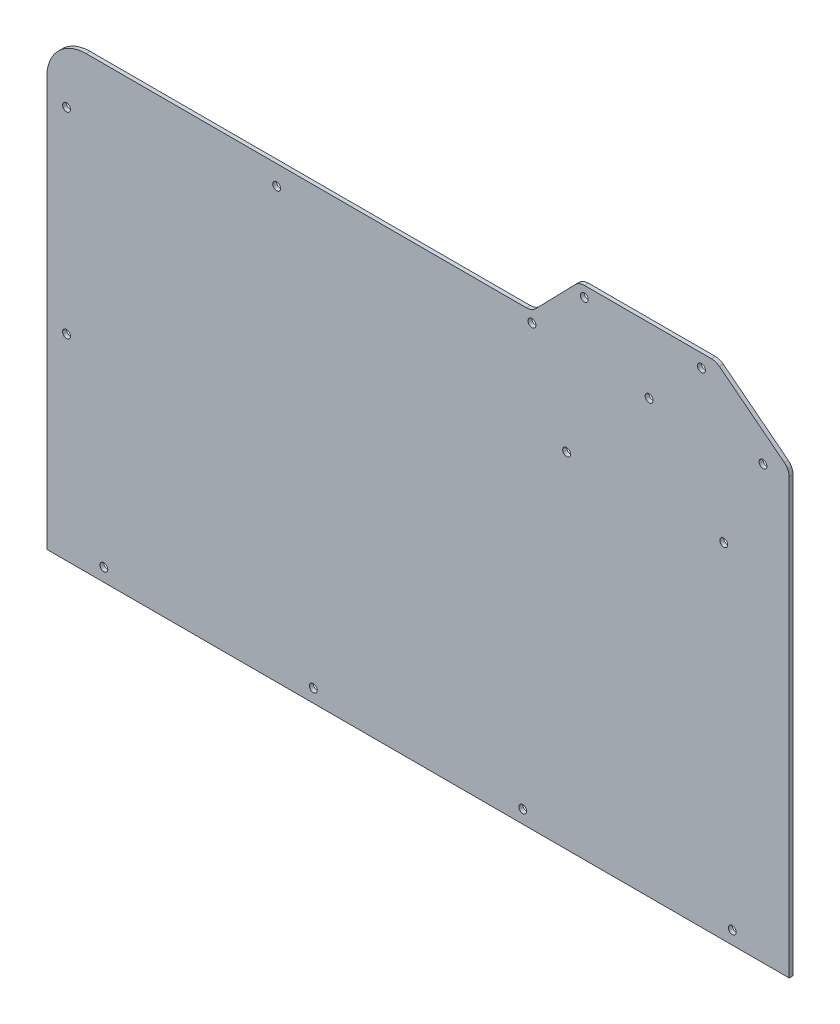
ISO-10303-21;
HEADER;
FILE_DESCRIPTION(('STEP AP214'),'2;1');
FILE_NAME('part.step','',(''),(''),'','','');
FILE_SCHEMA(('AUTOMOTIVE_DESIGN { 1 0 10303 214 1 1 1 1 }'));
ENDSEC;
DATA;
#1=APPLICATION_CONTEXT('core data for automotive mechanical design processes');
#2=APPLICATION_PROTOCOL_DEFINITION('international standard','automotive_design',2000,#1);
#3=PRODUCT_CONTEXT('',#1,'mechanical');
#4=PRODUCT('Part','Part','',(#3));
#5=PRODUCT_RELATED_PRODUCT_CATEGORY('part','',(#4));
#6=PRODUCT_DEFINITION_FORMATION('','',#4);
#7=PRODUCT_DEFINITION_CONTEXT('part definition',#1,'design');
#8=PRODUCT_DEFINITION('design','',#6,#7);
#9=PRODUCT_DEFINITION_SHAPE('','',#8);
#10=(LENGTH_UNIT() NAMED_UNIT(*) SI_UNIT(.MILLI.,.METRE.));
#11=(NAMED_UNIT(*) PLANE_ANGLE_UNIT() SI_UNIT($,.RADIAN.));
#12=(NAMED_UNIT(*) SI_UNIT($,.STERADIAN.) SOLID_ANGLE_UNIT());
#13=UNCERTAINTY_MEASURE_WITH_UNIT(LENGTH_MEASURE(1.E-05),#10,'distance_accuracy_value','');
#14=(GEOMETRIC_REPRESENTATION_CONTEXT(3) GLOBAL_UNCERTAINTY_ASSIGNED_CONTEXT((#13)) GLOBAL_UNIT_ASSIGNED_CONTEXT((#10,
#11,#12)) REPRESENTATION_CONTEXT('',''));
#15=CARTESIAN_POINT('',(0.,0.,0.));
#16=DIRECTION('',(0.,0.,1.));
#17=DIRECTION('',(1.,0.,0.));
#18=AXIS2_PLACEMENT_3D('',#15,#16,#17);
#19=CARTESIAN_POINT('',(0.,0.,1.5));
#20=DIRECTION('',(1.,0.,0.));
#21=DIRECTION('',(0.,0.,-1.));
#22=AXIS2_PLACEMENT_3D('',#19,#20,#21);
#23=PLANE('',#22);
#24=DIRECTION('',(0.,-1.,0.));
#25=VECTOR('',#24,1.);
#26=CARTESIAN_POINT('',(0.,0.,1.5));
#27=LINE('',#26,#25);
#28=CARTESIAN_POINT('',(0.,156.5,1.5));
#29=VERTEX_POINT('',#28);
#30=CARTESIAN_POINT('',(0.,0.,1.5));
#31=VERTEX_POINT('',#30);
#32=EDGE_CURVE('E121',#29,#31,#27,.T.);
#33=ORIENTED_EDGE('',*,*,#32,.F.);
#34=DIRECTION('',(0.,0.,-1.));
#35=VECTOR('',#34,1.);
#36=CARTESIAN_POINT('',(0.,156.5,1.5));
#37=LINE('',#36,#35);
#38=CARTESIAN_POINT('',(0.,156.5,0.));
#39=VERTEX_POINT('',#38);
#40=EDGE_CURVE('E186',#29,#39,#37,.T.);
#41=ORIENTED_EDGE('',*,*,#40,.T.);
#42=DIRECTION('',(0.,-1.,0.));
#43=VECTOR('',#42,1.);
#44=CARTESIAN_POINT('',(0.,0.,0.));
#45=LINE('',#44,#43);
#46=CARTESIAN_POINT('',(0.,0.,0.));
#47=VERTEX_POINT('',#46);
#48=EDGE_CURVE('E143',#39,#47,#45,.T.);
#49=ORIENTED_EDGE('',*,*,#48,.T.);
#50=DIRECTION('',(0.,0.,-1.));
#51=VECTOR('',#50,1.);
#52=CARTESIAN_POINT('',(0.,0.,1.5));
#53=LINE('',#52,#51);
#54=EDGE_CURVE('E137',#31,#47,#53,.T.);
#55=ORIENTED_EDGE('',*,*,#54,.F.);
#56=EDGE_LOOP('',(#33,#41,#49,#55));
#57=FACE_BOUND('',#56,.T.);
#58=ADVANCED_FACE('F33',(#57),#23,.F.);
#59=CARTESIAN_POINT('',(0.,0.,1.5));
#60=DIRECTION('',(0.,1.,0.));
#61=DIRECTION('',(0.,0.,1.));
#62=AXIS2_PLACEMENT_3D('',#59,#60,#61);
#63=PLANE('',#62);
#64=DIRECTION('',(1.,0.,0.));
#65=VECTOR('',#64,1.);
#66=CARTESIAN_POINT('',(0.,0.,0.));
#67=LINE('',#66,#65);
#68=CARTESIAN_POINT('',(283.5,0.,0.));
#69=VERTEX_POINT('',#68);
#70=EDGE_CURVE('E191',#47,#69,#67,.T.);
#71=ORIENTED_EDGE('',*,*,#70,.T.);
#72=DIRECTION('',(0.,0.,-1.));
#73=VECTOR('',#72,1.);
#74=CARTESIAN_POINT('',(283.5,0.,1.5));
#75=LINE('',#74,#73);
#76=CARTESIAN_POINT('',(283.5,0.,1.5));
#77=VERTEX_POINT('',#76);
#78=EDGE_CURVE('E139',#77,#69,#75,.T.);
#79=ORIENTED_EDGE('',*,*,#78,.F.);
#80=DIRECTION('',(1.,0.,0.));
#81=VECTOR('',#80,1.);
#82=CARTESIAN_POINT('',(0.,0.,1.5));
#83=LINE('',#82,#81);
#84=EDGE_CURVE('E125',#31,#77,#83,.T.);
#85=ORIENTED_EDGE('',*,*,#84,.F.);
#86=ORIENTED_EDGE('',*,*,#54,.T.);
#87=EDGE_LOOP('',(#71,#79,#85,#86));
#88=FACE_BOUND('',#87,.T.);
#89=ADVANCED_FACE('F136',(#88),#63,.F.);
#90=CARTESIAN_POINT('',(283.5,0.,1.5));
#91=DIRECTION('',(-1.,0.,0.));
#92=DIRECTION('',(0.,0.,1.));
#93=AXIS2_PLACEMENT_3D('',#90,#91,#92);
#94=PLANE('',#93);
#95=DIRECTION('',(0.,1.,0.));
#96=VECTOR('',#95,1.);
#97=CARTESIAN_POINT('',(283.5,0.,0.));
#98=LINE('',#97,#96);
#99=CARTESIAN_POINT('',(283.5,165.685339514982,0.));
#100=VERTEX_POINT('',#99);
#101=EDGE_CURVE('E194',#69,#100,#98,.T.);
#102=ORIENTED_EDGE('',*,*,#101,.T.);
#103=DIRECTION('',(0.,0.,-1.));
#104=VECTOR('',#103,1.);
#105=CARTESIAN_POINT('',(283.5,165.685339514982,1.5));
#106=LINE('',#105,#104);
#107=CARTESIAN_POINT('',(283.5,165.685339514982,1.5));
#108=VERTEX_POINT('',#107);
#109=EDGE_CURVE('E161',#100,#108,#106,.F.);
#110=ORIENTED_EDGE('',*,*,#109,.T.);
#111=DIRECTION('',(0.,1.,0.));
#112=VECTOR('',#111,1.);
#113=CARTESIAN_POINT('',(283.5,0.,1.5));
#114=LINE('',#113,#112);
#115=EDGE_CURVE('E141',#77,#108,#114,.T.);
#116=ORIENTED_EDGE('',*,*,#115,.F.);
#117=ORIENTED_EDGE('',*,*,#78,.T.);
#118=EDGE_LOOP('',(#102,#110,#116,#117));
#119=FACE_BOUND('',#118,.T.);
#120=ADVANCED_FACE('F231',(#119),#94,.F.);
#121=CARTESIAN_POINT('',(255.5,189.999999999999,1.5));
#122=DIRECTION('',(-0.615661475325659,-0.788010753606721,0.));
#123=DIRECTION('',(0.788010753606721,-0.615661475325659,0.));
#124=AXIS2_PLACEMENT_3D('',#121,#122,#123);
#125=PLANE('',#124);
#126=DIRECTION('',(-0.788010753606721,0.615661475325659,0.));
#127=VECTOR('',#126,1.);
#128=CARTESIAN_POINT('',(255.5,189.999999999999,1.5));
#129=LINE('',#128,#127);
#130=CARTESIAN_POINT('',(281.578307376628,169.625393283016,1.5));
#131=VERTEX_POINT('',#130);
#132=CARTESIAN_POINT('',(256.85666931018,188.940053768033,1.5));
#133=VERTEX_POINT('',#132);
#134=EDGE_CURVE('E262',#131,#133,#129,.T.);
#135=ORIENTED_EDGE('',*,*,#134,.F.);
#136=DIRECTION('',(0.,0.,-1.));
#137=VECTOR('',#136,1.);
#138=CARTESIAN_POINT('',(281.578307376628,169.625393283016,1.5));
#139=LINE('',#138,#137);
#140=CARTESIAN_POINT('',(281.578307376628,169.625393283016,0.));
#141=VERTEX_POINT('',#140);
#142=EDGE_CURVE('E147',#131,#141,#139,.T.);
#143=ORIENTED_EDGE('',*,*,#142,.T.);
#144=DIRECTION('',(-0.788010753606721,0.615661475325659,0.));
#145=VECTOR('',#144,1.);
#146=CARTESIAN_POINT('',(255.5,189.999999999999,0.));
#147=LINE('',#146,#145);
#148=CARTESIAN_POINT('',(256.85666931018,188.940053768033,0.));
#149=VERTEX_POINT('',#148);
#150=EDGE_CURVE('E204',#141,#149,#147,.T.);
#151=ORIENTED_EDGE('',*,*,#150,.T.);
#152=DIRECTION('',(0.,0.,-1.));
#153=VECTOR('',#152,1.);
#154=CARTESIAN_POINT('',(256.85666931018,188.940053768033,1.5));
#155=LINE('',#154,#153);
#156=EDGE_CURVE('E145',#149,#133,#155,.F.);
#157=ORIENTED_EDGE('',*,*,#156,.T.);
#158=EDGE_LOOP('',(#135,#143,#151,#157));
#159=FACE_BOUND('',#158,.T.);
#160=ADVANCED_FACE('F408',(#159),#125,.F.);
#161=CARTESIAN_POINT('',(203.249999999999,189.999999999999,1.5));
#162=DIRECTION('',(0.,-1.,0.));
#163=DIRECTION('',(0.,0.,-1.));
#164=AXIS2_PLACEMENT_3D('',#161,#162,#163);
#165=PLANE('',#164);
#166=DIRECTION('',(-1.,0.,0.));
#167=VECTOR('',#166,1.);
#168=CARTESIAN_POINT('',(203.249999999999,189.999999999999,1.5));
#169=LINE('',#168,#167);
#170=CARTESIAN_POINT('',(253.778361933552,189.999999999999,1.5));
#171=VERTEX_POINT('',#170);
#172=CARTESIAN_POINT('',(205.361302431967,189.999999999999,1.5));
#173=VERTEX_POINT('',#172);
#174=EDGE_CURVE('E257',#171,#173,#169,.T.);
#175=ORIENTED_EDGE('',*,*,#174,.F.);
#176=DIRECTION('',(0.,0.,-1.));
#177=VECTOR('',#176,1.);
#178=CARTESIAN_POINT('',(253.778361933552,189.999999999999,1.5));
#179=LINE('',#178,#177);
#180=CARTESIAN_POINT('',(253.778361933552,189.999999999999,0.));
#181=VERTEX_POINT('',#180);
#182=EDGE_CURVE('E171',#171,#181,#179,.T.);
#183=ORIENTED_EDGE('',*,*,#182,.T.);
#184=DIRECTION('',(-1.,0.,0.));
#185=VECTOR('',#184,1.);
#186=CARTESIAN_POINT('',(203.249999999999,189.999999999999,0.));
#187=LINE('',#186,#185);
#188=CARTESIAN_POINT('',(205.361302431967,189.999999999999,0.));
#189=VERTEX_POINT('',#188);
#190=EDGE_CURVE('E207',#181,#189,#187,.T.);
#191=ORIENTED_EDGE('',*,*,#190,.T.);
#192=DIRECTION('',(0.,0.,-1.));
#193=VECTOR('',#192,1.);
#194=CARTESIAN_POINT('',(205.361302431967,189.999999999999,1.5));
#195=LINE('',#194,#193);
#196=EDGE_CURVE('E169',#189,#173,#195,.F.);
#197=ORIENTED_EDGE('',*,*,#196,.T.);
#198=EDGE_LOOP('',(#175,#183,#191,#197));
#199=FACE_BOUND('',#198,.T.);
#200=ADVANCED_FACE('F405',(#199),#165,.F.);
#201=CARTESIAN_POINT('',(185.25,171.5,1.5));
#202=DIRECTION('',(0.716725930909103,-0.697354959803456,0.));
#203=DIRECTION('',(0.697354959803456,0.716725930909103,0.));
#204=AXIS2_PLACEMENT_3D('',#201,#202,#203);
#205=PLANE('',#204);
#206=DIRECTION('',(-0.697354959803456,-0.716725930909103,0.));
#207=VECTOR('',#206,1.);
#208=CARTESIAN_POINT('',(185.25,171.5,1.5));
#209=LINE('',#208,#207);
#210=CARTESIAN_POINT('',(201.777672777422,188.486774799017,1.5));
#211=VERTEX_POINT('',#210);
#212=CARTESIAN_POINT('',(186.722327222578,173.013225200983,1.5));
#213=VERTEX_POINT('',#212);
#214=EDGE_CURVE('E254',#211,#213,#209,.T.);
#215=ORIENTED_EDGE('',*,*,#214,.F.);
#216=DIRECTION('',(0.,0.,-1.));
#217=VECTOR('',#216,1.);
#218=CARTESIAN_POINT('',(201.777672777422,188.486774799017,1.5));
#219=LINE('',#218,#217);
#220=CARTESIAN_POINT('',(201.777672777422,188.486774799017,0.));
#221=VERTEX_POINT('',#220);
#222=EDGE_CURVE('E176',#211,#221,#219,.T.);
#223=ORIENTED_EDGE('',*,*,#222,.T.);
#224=DIRECTION('',(-0.697354959803456,-0.716725930909103,0.));
#225=VECTOR('',#224,1.);
#226=CARTESIAN_POINT('',(185.25,171.5,0.));
#227=LINE('',#226,#225);
#228=CARTESIAN_POINT('',(186.722327222578,173.013225200983,0.));
#229=VERTEX_POINT('',#228);
#230=EDGE_CURVE('E210',#221,#229,#227,.T.);
#231=ORIENTED_EDGE('',*,*,#230,.T.);
#232=DIRECTION('',(0.,0.,-1.));
#233=VECTOR('',#232,1.);
#234=CARTESIAN_POINT('',(186.722327222578,173.013225200983,1.5));
#235=LINE('',#234,#233);
#236=EDGE_CURVE('E174',#229,#213,#235,.F.);
#237=ORIENTED_EDGE('',*,*,#236,.T.);
#238=EDGE_LOOP('',(#215,#223,#231,#237));
#239=FACE_BOUND('',#238,.T.);
#240=ADVANCED_FACE('F259',(#239),#205,.F.);
#241=CARTESIAN_POINT('',(0.,171.5,1.5));
#242=DIRECTION('',(0.,-1.,0.));
#243=DIRECTION('',(1.,0.,0.));
#244=AXIS2_PLACEMENT_3D('',#241,#242,#243);
#245=PLANE('',#244);
#246=DIRECTION('',(-1.,0.,0.));
#247=VECTOR('',#246,1.);
#248=CARTESIAN_POINT('',(0.,171.5,0.));
#249=LINE('',#248,#247);
#250=CARTESIAN_POINT('',(183.138697568032,171.5,0.));
#251=VERTEX_POINT('',#250);
#252=CARTESIAN_POINT('',(15.,171.5,0.));
#253=VERTEX_POINT('',#252);
#254=EDGE_CURVE('E132',#251,#253,#249,.T.);
#255=ORIENTED_EDGE('',*,*,#254,.T.);
#256=DIRECTION('',(0.,0.,-1.));
#257=VECTOR('',#256,1.);
#258=CARTESIAN_POINT('',(15.,171.5,1.5));
#259=LINE('',#258,#257);
#260=CARTESIAN_POINT('',(15.,171.5,1.5));
#261=VERTEX_POINT('',#260);
#262=EDGE_CURVE('E41',#253,#261,#259,.F.);
#263=ORIENTED_EDGE('',*,*,#262,.T.);
#264=DIRECTION('',(-1.,0.,0.));
#265=VECTOR('',#264,1.);
#266=CARTESIAN_POINT('',(0.,171.5,1.5));
#267=LINE('',#266,#265);
#268=CARTESIAN_POINT('',(183.138697568032,171.5,1.5));
#269=VERTEX_POINT('',#268);
#270=EDGE_CURVE('E149',#269,#261,#267,.T.);
#271=ORIENTED_EDGE('',*,*,#270,.F.);
#272=DIRECTION('',(0.,0.,-1.));
#273=VECTOR('',#272,1.);
#274=CARTESIAN_POINT('',(183.138697568032,171.5,0.));
#275=LINE('',#274,#273);
#276=EDGE_CURVE('E179',#269,#251,#275,.T.);
#277=ORIENTED_EDGE('',*,*,#276,.T.);
#278=EDGE_LOOP('',(#255,#263,#271,#277));
#279=FACE_BOUND('',#278,.T.);
#280=ADVANCED_FACE('F212',(#279),#245,.F.);
#281=CARTESIAN_POINT('',(0.,0.,1.5));
#282=DIRECTION('',(0.,0.,-1.));
#283=DIRECTION('',(-1.,0.,0.));
#284=AXIS2_PLACEMENT_3D('',#281,#282,#283);
#285=PLANE('',#284);
#286=CARTESIAN_POINT('',(258.5,131.5,1.5));
#287=DIRECTION('',(0.,0.,1.));
#288=DIRECTION('',(1.,0.,0.));
#289=AXIS2_PLACEMENT_3D('',#286,#287,#288);
#290=CIRCLE('',#289,1.50000000000002);
#291=CARTESIAN_POINT('',(260.,131.5,1.5));
#292=VERTEX_POINT('',#291);
#293=EDGE_CURVE('E343',#292,#292,#290,.T.);
#294=ORIENTED_EDGE('',*,*,#293,.F.);
#295=EDGE_LOOP('',(#294));
#296=FACE_BOUND('',#295,.T.);
#297=CARTESIAN_POINT('',(198.5,131.5,1.5));
#298=DIRECTION('',(0.,0.,1.));
#299=DIRECTION('',(1.,0.,0.));
#300=AXIS2_PLACEMENT_3D('',#297,#298,#299);
#301=CIRCLE('',#300,1.5);
#302=CARTESIAN_POINT('',(200.,131.5,1.5));
#303=VERTEX_POINT('',#302);
#304=EDGE_CURVE('E337',#303,#303,#301,.T.);
#305=ORIENTED_EDGE('',*,*,#304,.F.);
#306=EDGE_LOOP('',(#305));
#307=FACE_BOUND('',#306,.T.);
#308=CARTESIAN_POINT('',(273.5,164.999999999999,1.5));
#309=DIRECTION('',(0.,0.,1.));
#310=DIRECTION('',(1.,0.,0.));
#311=AXIS2_PLACEMENT_3D('',#308,#309,#310);
#312=CIRCLE('',#311,1.50000000000002);
#313=CARTESIAN_POINT('',(275.,164.999999999999,1.5));
#314=VERTEX_POINT('',#313);
#315=EDGE_CURVE('E331',#314,#314,#312,.T.);
#316=ORIENTED_EDGE('',*,*,#315,.F.);
#317=EDGE_LOOP('',(#316));
#318=FACE_BOUND('',#317,.T.);
#319=CARTESIAN_POINT('',(250.000000000003,184.999999999997,1.5));
#320=DIRECTION('',(0.,0.,1.));
#321=DIRECTION('',(1.,0.,0.));
#322=AXIS2_PLACEMENT_3D('',#319,#320,#321);
#323=CIRCLE('',#322,1.4999999999837);
#324=CARTESIAN_POINT('',(251.499999999986,184.999999999997,1.5));
#325=VERTEX_POINT('',#324);
#326=EDGE_CURVE('E325',#325,#325,#323,.T.);
#327=ORIENTED_EDGE('',*,*,#326,.F.);
#328=EDGE_LOOP('',(#327));
#329=FACE_BOUND('',#328,.T.);
#330=CARTESIAN_POINT('',(230.000000000003,164.999999999997,1.5));
#331=DIRECTION('',(0.,0.,1.));
#332=DIRECTION('',(1.,0.,0.));
#333=AXIS2_PLACEMENT_3D('',#330,#331,#332);
#334=CIRCLE('',#333,1.49999999998371);
#335=CARTESIAN_POINT('',(231.499999999986,164.999999999997,1.5));
#336=VERTEX_POINT('',#335);
#337=EDGE_CURVE('E319',#336,#336,#334,.T.);
#338=ORIENTED_EDGE('',*,*,#337,.F.);
#339=EDGE_LOOP('',(#338));
#340=FACE_BOUND('',#339,.T.);
#341=CARTESIAN_POINT('',(205.25,186.,1.5));
#342=DIRECTION('',(0.,0.,1.));
#343=DIRECTION('',(1.,0.,0.));
#344=AXIS2_PLACEMENT_3D('',#341,#342,#343);
#345=CIRCLE('',#344,1.5);
#346=CARTESIAN_POINT('',(206.75,186.,1.5));
#347=VERTEX_POINT('',#346);
#348=EDGE_CURVE('E313',#347,#347,#345,.T.);
#349=ORIENTED_EDGE('',*,*,#348,.F.);
#350=EDGE_LOOP('',(#349));
#351=FACE_BOUND('',#350,.T.);
#352=CARTESIAN_POINT('',(185.25,167.5,1.5));
#353=DIRECTION('',(0.,0.,1.));
#354=DIRECTION('',(1.,0.,0.));
#355=AXIS2_PLACEMENT_3D('',#352,#353,#354);
#356=CIRCLE('',#355,1.5);
#357=CARTESIAN_POINT('',(186.75,167.5,1.5));
#358=VERTEX_POINT('',#357);
#359=EDGE_CURVE('E307',#358,#358,#356,.T.);
#360=ORIENTED_EDGE('',*,*,#359,.F.);
#361=EDGE_LOOP('',(#360));
#362=FACE_BOUND('',#361,.T.);
#363=CARTESIAN_POINT('',(87.75,164.,1.5));
#364=DIRECTION('',(0.,0.,1.));
#365=DIRECTION('',(1.,0.,0.));
#366=AXIS2_PLACEMENT_3D('',#363,#364,#365);
#367=CIRCLE('',#366,1.5);
#368=CARTESIAN_POINT('',(89.25,164.,1.5));
#369=VERTEX_POINT('',#368);
#370=EDGE_CURVE('E301',#369,#369,#367,.T.);
#371=ORIENTED_EDGE('',*,*,#370,.F.);
#372=EDGE_LOOP('',(#371));
#373=FACE_BOUND('',#372,.T.);
#374=CARTESIAN_POINT('',(7.5,150.,1.5));
#375=DIRECTION('',(0.,0.,1.));
#376=DIRECTION('',(1.,0.,0.));
#377=AXIS2_PLACEMENT_3D('',#374,#375,#376);
#378=CIRCLE('',#377,1.5);
#379=CARTESIAN_POINT('',(9.,150.,1.5));
#380=VERTEX_POINT('',#379);
#381=EDGE_CURVE('E295',#380,#380,#378,.T.);
#382=ORIENTED_EDGE('',*,*,#381,.F.);
#383=EDGE_LOOP('',(#382));
#384=FACE_BOUND('',#383,.T.);
#385=CARTESIAN_POINT('',(7.5,75.,1.5));
#386=DIRECTION('',(0.,0.,1.));
#387=DIRECTION('',(1.,0.,0.));
#388=AXIS2_PLACEMENT_3D('',#385,#386,#387);
#389=CIRCLE('',#388,1.5);
#390=CARTESIAN_POINT('',(9.,75.,1.5));
#391=VERTEX_POINT('',#390);
#392=EDGE_CURVE('E289',#391,#391,#389,.T.);
#393=ORIENTED_EDGE('',*,*,#392,.F.);
#394=EDGE_LOOP('',(#393));
#395=FACE_BOUND('',#394,.T.);
#396=CARTESIAN_POINT('',(21.75,5.,1.5));
#397=DIRECTION('',(0.,0.,1.));
#398=DIRECTION('',(1.,0.,0.));
#399=AXIS2_PLACEMENT_3D('',#396,#397,#398);
#400=CIRCLE('',#399,1.5);
#401=CARTESIAN_POINT('',(23.25,5.,1.5));
#402=VERTEX_POINT('',#401);
#403=EDGE_CURVE('E283',#402,#402,#400,.T.);
#404=ORIENTED_EDGE('',*,*,#403,.F.);
#405=EDGE_LOOP('',(#404));
#406=FACE_BOUND('',#405,.T.);
#407=CARTESIAN_POINT('',(101.75,5.,1.5));
#408=DIRECTION('',(0.,0.,1.));
#409=DIRECTION('',(1.,0.,0.));
#410=AXIS2_PLACEMENT_3D('',#407,#408,#409);
#411=CIRCLE('',#410,1.5);
#412=CARTESIAN_POINT('',(103.25,5.,1.5));
#413=VERTEX_POINT('',#412);
#414=EDGE_CURVE('E277',#413,#413,#411,.T.);
#415=ORIENTED_EDGE('',*,*,#414,.F.);
#416=EDGE_LOOP('',(#415));
#417=FACE_BOUND('',#416,.T.);
#418=CARTESIAN_POINT('',(181.75,5.,1.5));
#419=DIRECTION('',(0.,0.,1.));
#420=DIRECTION('',(1.,0.,0.));
#421=AXIS2_PLACEMENT_3D('',#418,#419,#420);
#422=CIRCLE('',#421,1.5);
#423=CARTESIAN_POINT('',(183.25,5.,1.5));
#424=VERTEX_POINT('',#423);
#425=EDGE_CURVE('E271',#424,#424,#422,.T.);
#426=ORIENTED_EDGE('',*,*,#425,.F.);
#427=EDGE_LOOP('',(#426));
#428=FACE_BOUND('',#427,.T.);
#429=CARTESIAN_POINT('',(261.75,5.,1.5));
#430=DIRECTION('',(0.,0.,1.));
#431=DIRECTION('',(1.,0.,0.));
#432=AXIS2_PLACEMENT_3D('',#429,#430,#431);
#433=CIRCLE('',#432,1.50000000000002);
#434=CARTESIAN_POINT('',(263.25,5.,1.5));
#435=VERTEX_POINT('',#434);
#436=EDGE_CURVE('E197',#435,#435,#433,.T.);
#437=ORIENTED_EDGE('',*,*,#436,.F.);
#438=EDGE_LOOP('',(#437));
#439=FACE_BOUND('',#438,.T.);
#440=ORIENTED_EDGE('',*,*,#270,.T.);
#441=CARTESIAN_POINT('',(15.,156.5,1.5));
#442=DIRECTION('',(0.,0.,-1.));
#443=DIRECTION('',(-1.,0.,0.));
#444=AXIS2_PLACEMENT_3D('',#441,#442,#443);
#445=CIRCLE('',#444,15.);
#446=EDGE_CURVE('E11',#261,#29,#445,.F.);
#447=ORIENTED_EDGE('',*,*,#446,.T.);
#448=ORIENTED_EDGE('',*,*,#32,.T.);
#449=ORIENTED_EDGE('',*,*,#84,.T.);
#450=ORIENTED_EDGE('',*,*,#115,.T.);
#451=CARTESIAN_POINT('',(278.5,165.685339514982,1.5));
#452=DIRECTION('',(0.,0.,-1.));
#453=DIRECTION('',(-1.,0.,0.));
#454=AXIS2_PLACEMENT_3D('',#451,#452,#453);
#455=CIRCLE('',#454,5.);
#456=EDGE_CURVE('E167',#108,#131,#455,.F.);
#457=ORIENTED_EDGE('',*,*,#456,.T.);
#458=ORIENTED_EDGE('',*,*,#134,.T.);
#459=CARTESIAN_POINT('',(253.778361933552,184.999999999999,1.5));
#460=DIRECTION('',(0.,0.,-1.));
#461=DIRECTION('',(-1.,0.,0.));
#462=AXIS2_PLACEMENT_3D('',#459,#460,#461);
#463=CIRCLE('',#462,5.);
#464=EDGE_CURVE('E165',#133,#171,#463,.F.);
#465=ORIENTED_EDGE('',*,*,#464,.T.);
#466=ORIENTED_EDGE('',*,*,#174,.T.);
#467=CARTESIAN_POINT('',(205.361302431967,184.999999999999,1.5));
#468=DIRECTION('',(0.,0.,-1.));
#469=DIRECTION('',(-1.,0.,0.));
#470=AXIS2_PLACEMENT_3D('',#467,#468,#469);
#471=CIRCLE('',#470,5.);
#472=EDGE_CURVE('E163',#173,#211,#471,.F.);
#473=ORIENTED_EDGE('',*,*,#472,.T.);
#474=ORIENTED_EDGE('',*,*,#214,.T.);
#475=CARTESIAN_POINT('',(183.138697568032,176.5,1.5));
#476=DIRECTION('',(0.,0.,-1.));
#477=DIRECTION('',(-1.,0.,0.));
#478=AXIS2_PLACEMENT_3D('',#475,#476,#477);
#479=CIRCLE('',#478,5.);
#480=EDGE_CURVE('E184',#213,#269,#479,.T.);
#481=ORIENTED_EDGE('',*,*,#480,.T.);
#482=EDGE_LOOP('',(#440,#447,#448,#449,#450,#457,#458,#465,#466,#473,#474,#481));
#483=FACE_BOUND('',#482,.T.);
#484=ADVANCED_FACE('F123',(#296,#307,#318,#329,#340,#351,#362,#373,#384,#395,#406,#417,#428,
#439,#483),#285,.F.);
#485=CARTESIAN_POINT('',(0.,0.,0.));
#486=DIRECTION('',(0.,0.,-1.));
#487=DIRECTION('',(-1.,0.,0.));
#488=AXIS2_PLACEMENT_3D('',#485,#486,#487);
#489=PLANE('',#488);
#490=CARTESIAN_POINT('',(258.5,131.5,0.));
#491=DIRECTION('',(0.,0.,1.));
#492=DIRECTION('',(1.,0.,0.));
#493=AXIS2_PLACEMENT_3D('',#490,#491,#492);
#494=CIRCLE('',#493,1.50000000000002);
#495=CARTESIAN_POINT('',(260.,131.5,0.));
#496=VERTEX_POINT('',#495);
#497=EDGE_CURVE('E340',#496,#496,#494,.T.);
#498=ORIENTED_EDGE('',*,*,#497,.T.);
#499=EDGE_LOOP('',(#498));
#500=FACE_BOUND('',#499,.T.);
#501=CARTESIAN_POINT('',(198.5,131.5,0.));
#502=DIRECTION('',(0.,0.,1.));
#503=DIRECTION('',(1.,0.,0.));
#504=AXIS2_PLACEMENT_3D('',#501,#502,#503);
#505=CIRCLE('',#504,1.5);
#506=CARTESIAN_POINT('',(200.,131.5,0.));
#507=VERTEX_POINT('',#506);
#508=EDGE_CURVE('E334',#507,#507,#505,.T.);
#509=ORIENTED_EDGE('',*,*,#508,.T.);
#510=EDGE_LOOP('',(#509));
#511=FACE_BOUND('',#510,.T.);
#512=CARTESIAN_POINT('',(273.5,164.999999999999,0.));
#513=DIRECTION('',(0.,0.,1.));
#514=DIRECTION('',(1.,0.,0.));
#515=AXIS2_PLACEMENT_3D('',#512,#513,#514);
#516=CIRCLE('',#515,1.50000000000002);
#517=CARTESIAN_POINT('',(275.,164.999999999999,0.));
#518=VERTEX_POINT('',#517);
#519=EDGE_CURVE('E328',#518,#518,#516,.T.);
#520=ORIENTED_EDGE('',*,*,#519,.T.);
#521=EDGE_LOOP('',(#520));
#522=FACE_BOUND('',#521,.T.);
#523=CARTESIAN_POINT('',(250.000000000003,184.999999999997,0.));
#524=DIRECTION('',(0.,0.,1.));
#525=DIRECTION('',(1.,0.,0.));
#526=AXIS2_PLACEMENT_3D('',#523,#524,#525);
#527=CIRCLE('',#526,1.4999999999837);
#528=CARTESIAN_POINT('',(251.499999999986,184.999999999997,0.));
#529=VERTEX_POINT('',#528);
#530=EDGE_CURVE('E322',#529,#529,#527,.T.);
#531=ORIENTED_EDGE('',*,*,#530,.T.);
#532=EDGE_LOOP('',(#531));
#533=FACE_BOUND('',#532,.T.);
#534=CARTESIAN_POINT('',(230.000000000003,164.999999999997,0.));
#535=DIRECTION('',(0.,0.,1.));
#536=DIRECTION('',(1.,0.,0.));
#537=AXIS2_PLACEMENT_3D('',#534,#535,#536);
#538=CIRCLE('',#537,1.49999999998371);
#539=CARTESIAN_POINT('',(231.499999999986,164.999999999997,0.));
#540=VERTEX_POINT('',#539);
#541=EDGE_CURVE('E316',#540,#540,#538,.T.);
#542=ORIENTED_EDGE('',*,*,#541,.T.);
#543=EDGE_LOOP('',(#542));
#544=FACE_BOUND('',#543,.T.);
#545=CARTESIAN_POINT('',(205.25,186.,0.));
#546=DIRECTION('',(0.,0.,1.));
#547=DIRECTION('',(1.,0.,0.));
#548=AXIS2_PLACEMENT_3D('',#545,#546,#547);
#549=CIRCLE('',#548,1.5);
#550=CARTESIAN_POINT('',(206.75,186.,0.));
#551=VERTEX_POINT('',#550);
#552=EDGE_CURVE('E310',#551,#551,#549,.T.);
#553=ORIENTED_EDGE('',*,*,#552,.T.);
#554=EDGE_LOOP('',(#553));
#555=FACE_BOUND('',#554,.T.);
#556=CARTESIAN_POINT('',(185.25,167.5,0.));
#557=DIRECTION('',(0.,0.,1.));
#558=DIRECTION('',(1.,0.,0.));
#559=AXIS2_PLACEMENT_3D('',#556,#557,#558);
#560=CIRCLE('',#559,1.5);
#561=CARTESIAN_POINT('',(186.75,167.5,0.));
#562=VERTEX_POINT('',#561);
#563=EDGE_CURVE('E304',#562,#562,#560,.T.);
#564=ORIENTED_EDGE('',*,*,#563,.T.);
#565=EDGE_LOOP('',(#564));
#566=FACE_BOUND('',#565,.T.);
#567=CARTESIAN_POINT('',(87.75,164.,0.));
#568=DIRECTION('',(0.,0.,1.));
#569=DIRECTION('',(1.,0.,0.));
#570=AXIS2_PLACEMENT_3D('',#567,#568,#569);
#571=CIRCLE('',#570,1.5);
#572=CARTESIAN_POINT('',(89.25,164.,0.));
#573=VERTEX_POINT('',#572);
#574=EDGE_CURVE('E298',#573,#573,#571,.T.);
#575=ORIENTED_EDGE('',*,*,#574,.T.);
#576=EDGE_LOOP('',(#575));
#577=FACE_BOUND('',#576,.T.);
#578=CARTESIAN_POINT('',(7.5,150.,0.));
#579=DIRECTION('',(0.,0.,1.));
#580=DIRECTION('',(1.,0.,0.));
#581=AXIS2_PLACEMENT_3D('',#578,#579,#580);
#582=CIRCLE('',#581,1.5);
#583=CARTESIAN_POINT('',(9.,150.,0.));
#584=VERTEX_POINT('',#583);
#585=EDGE_CURVE('E292',#584,#584,#582,.T.);
#586=ORIENTED_EDGE('',*,*,#585,.T.);
#587=EDGE_LOOP('',(#586));
#588=FACE_BOUND('',#587,.T.);
#589=CARTESIAN_POINT('',(7.5,75.,0.));
#590=DIRECTION('',(0.,0.,1.));
#591=DIRECTION('',(1.,0.,0.));
#592=AXIS2_PLACEMENT_3D('',#589,#590,#591);
#593=CIRCLE('',#592,1.5);
#594=CARTESIAN_POINT('',(9.,75.,0.));
#595=VERTEX_POINT('',#594);
#596=EDGE_CURVE('E286',#595,#595,#593,.T.);
#597=ORIENTED_EDGE('',*,*,#596,.T.);
#598=EDGE_LOOP('',(#597));
#599=FACE_BOUND('',#598,.T.);
#600=CARTESIAN_POINT('',(21.75,5.,0.));
#601=DIRECTION('',(0.,0.,1.));
#602=DIRECTION('',(1.,0.,0.));
#603=AXIS2_PLACEMENT_3D('',#600,#601,#602);
#604=CIRCLE('',#603,1.5);
#605=CARTESIAN_POINT('',(23.25,5.,0.));
#606=VERTEX_POINT('',#605);
#607=EDGE_CURVE('E280',#606,#606,#604,.T.);
#608=ORIENTED_EDGE('',*,*,#607,.T.);
#609=EDGE_LOOP('',(#608));
#610=FACE_BOUND('',#609,.T.);
#611=CARTESIAN_POINT('',(101.75,5.,0.));
#612=DIRECTION('',(0.,0.,1.));
#613=DIRECTION('',(1.,0.,0.));
#614=AXIS2_PLACEMENT_3D('',#611,#612,#613);
#615=CIRCLE('',#614,1.5);
#616=CARTESIAN_POINT('',(103.25,5.,0.));
#617=VERTEX_POINT('',#616);
#618=EDGE_CURVE('E274',#617,#617,#615,.T.);
#619=ORIENTED_EDGE('',*,*,#618,.T.);
#620=EDGE_LOOP('',(#619));
#621=FACE_BOUND('',#620,.T.);
#622=CARTESIAN_POINT('',(181.75,5.,0.));
#623=DIRECTION('',(0.,0.,1.));
#624=DIRECTION('',(1.,0.,0.));
#625=AXIS2_PLACEMENT_3D('',#622,#623,#624);
#626=CIRCLE('',#625,1.5);
#627=CARTESIAN_POINT('',(183.25,5.,0.));
#628=VERTEX_POINT('',#627);
#629=EDGE_CURVE('E269',#628,#628,#626,.T.);
#630=ORIENTED_EDGE('',*,*,#629,.T.);
#631=EDGE_LOOP('',(#630));
#632=FACE_BOUND('',#631,.T.);
#633=CARTESIAN_POINT('',(261.75,5.,0.));
#634=DIRECTION('',(0.,0.,1.));
#635=DIRECTION('',(1.,0.,0.));
#636=AXIS2_PLACEMENT_3D('',#633,#634,#635);
#637=CIRCLE('',#636,1.50000000000002);
#638=CARTESIAN_POINT('',(263.25,5.,0.));
#639=VERTEX_POINT('',#638);
#640=EDGE_CURVE('E192',#639,#639,#637,.T.);
#641=ORIENTED_EDGE('',*,*,#640,.T.);
#642=EDGE_LOOP('',(#641));
#643=FACE_BOUND('',#642,.T.);
#644=ORIENTED_EDGE('',*,*,#48,.F.);
#645=CARTESIAN_POINT('',(15.,156.5,0.));
#646=DIRECTION('',(0.,0.,-1.));
#647=DIRECTION('',(-1.,0.,0.));
#648=AXIS2_PLACEMENT_3D('',#645,#646,#647);
#649=CIRCLE('',#648,15.);
#650=EDGE_CURVE('E55',#39,#253,#649,.T.);
#651=ORIENTED_EDGE('',*,*,#650,.T.);
#652=ORIENTED_EDGE('',*,*,#254,.F.);
#653=CARTESIAN_POINT('',(183.138697568032,176.5,0.));
#654=DIRECTION('',(0.,0.,-1.));
#655=DIRECTION('',(-1.,0.,0.));
#656=AXIS2_PLACEMENT_3D('',#653,#654,#655);
#657=CIRCLE('',#656,5.);
#658=EDGE_CURVE('E182',#251,#229,#657,.F.);
#659=ORIENTED_EDGE('',*,*,#658,.T.);
#660=ORIENTED_EDGE('',*,*,#230,.F.);
#661=CARTESIAN_POINT('',(205.361302431967,184.999999999999,0.));
#662=DIRECTION('',(0.,0.,-1.));
#663=DIRECTION('',(-1.,0.,0.));
#664=AXIS2_PLACEMENT_3D('',#661,#662,#663);
#665=CIRCLE('',#664,5.);
#666=EDGE_CURVE('E155',#221,#189,#665,.T.);
#667=ORIENTED_EDGE('',*,*,#666,.T.);
#668=ORIENTED_EDGE('',*,*,#190,.F.);
#669=CARTESIAN_POINT('',(253.778361933552,184.999999999999,0.));
#670=DIRECTION('',(0.,0.,-1.));
#671=DIRECTION('',(-1.,0.,0.));
#672=AXIS2_PLACEMENT_3D('',#669,#670,#671);
#673=CIRCLE('',#672,5.);
#674=EDGE_CURVE('E157',#181,#149,#673,.T.);
#675=ORIENTED_EDGE('',*,*,#674,.T.);
#676=ORIENTED_EDGE('',*,*,#150,.F.);
#677=CARTESIAN_POINT('',(278.5,165.685339514982,0.));
#678=DIRECTION('',(0.,0.,-1.));
#679=DIRECTION('',(-1.,0.,0.));
#680=AXIS2_PLACEMENT_3D('',#677,#678,#679);
#681=CIRCLE('',#680,5.);
#682=EDGE_CURVE('E159',#141,#100,#681,.T.);
#683=ORIENTED_EDGE('',*,*,#682,.T.);
#684=ORIENTED_EDGE('',*,*,#101,.F.);
#685=ORIENTED_EDGE('',*,*,#70,.F.);
#686=EDGE_LOOP('',(#644,#651,#652,#659,#660,#667,#668,#675,#676,#683,#684,#685));
#687=FACE_BOUND('',#686,.T.);
#688=ADVANCED_FACE('F189',(#500,#511,#522,#533,#544,#555,#566,#577,#588,#599,#610,#621,#632,
#643,#687),#489,.T.);
#689=CARTESIAN_POINT('',(261.75,5.,0.));
#690=DIRECTION('',(0.,0.,1.));
#691=DIRECTION('',(1.,0.,0.));
#692=AXIS2_PLACEMENT_3D('',#689,#690,#691);
#693=CYLINDRICAL_SURFACE('',#692,1.50000000000002);
#694=ORIENTED_EDGE('',*,*,#640,.F.);
#695=EDGE_LOOP('',(#694));
#696=FACE_BOUND('',#695,.T.);
#697=ORIENTED_EDGE('',*,*,#436,.T.);
#698=EDGE_LOOP('',(#697));
#699=FACE_BOUND('',#698,.T.);
#700=ADVANCED_FACE('F385',(#696,#699),#693,.F.);
#701=CARTESIAN_POINT('',(181.75,5.,0.));
#702=DIRECTION('',(0.,0.,1.));
#703=DIRECTION('',(1.,0.,0.));
#704=AXIS2_PLACEMENT_3D('',#701,#702,#703);
#705=CYLINDRICAL_SURFACE('',#704,1.5);
#706=ORIENTED_EDGE('',*,*,#629,.F.);
#707=EDGE_LOOP('',(#706));
#708=FACE_BOUND('',#707,.T.);
#709=ORIENTED_EDGE('',*,*,#425,.T.);
#710=EDGE_LOOP('',(#709));
#711=FACE_BOUND('',#710,.T.);
#712=ADVANCED_FACE('F387',(#708,#711),#705,.F.);
#713=CARTESIAN_POINT('',(101.75,5.,0.));
#714=DIRECTION('',(0.,0.,1.));
#715=DIRECTION('',(1.,0.,0.));
#716=AXIS2_PLACEMENT_3D('',#713,#714,#715);
#717=CYLINDRICAL_SURFACE('',#716,1.5);
#718=ORIENTED_EDGE('',*,*,#618,.F.);
#719=EDGE_LOOP('',(#718));
#720=FACE_BOUND('',#719,.T.);
#721=ORIENTED_EDGE('',*,*,#414,.T.);
#722=EDGE_LOOP('',(#721));
#723=FACE_BOUND('',#722,.T.);
#724=ADVANCED_FACE('F394',(#720,#723),#717,.F.);
#725=CARTESIAN_POINT('',(21.75,5.,0.));
#726=DIRECTION('',(0.,0.,1.));
#727=DIRECTION('',(1.,0.,0.));
#728=AXIS2_PLACEMENT_3D('',#725,#726,#727);
#729=CYLINDRICAL_SURFACE('',#728,1.5);
#730=ORIENTED_EDGE('',*,*,#607,.F.);
#731=EDGE_LOOP('',(#730));
#732=FACE_BOUND('',#731,.T.);
#733=ORIENTED_EDGE('',*,*,#403,.T.);
#734=EDGE_LOOP('',(#733));
#735=FACE_BOUND('',#734,.T.);
#736=ADVANCED_FACE('F560',(#732,#735),#729,.F.);
#737=CARTESIAN_POINT('',(7.5,75.,0.));
#738=DIRECTION('',(0.,0.,1.));
#739=DIRECTION('',(1.,0.,0.));
#740=AXIS2_PLACEMENT_3D('',#737,#738,#739);
#741=CYLINDRICAL_SURFACE('',#740,1.5);
#742=ORIENTED_EDGE('',*,*,#596,.F.);
#743=EDGE_LOOP('',(#742));
#744=FACE_BOUND('',#743,.T.);
#745=ORIENTED_EDGE('',*,*,#392,.T.);
#746=EDGE_LOOP('',(#745));
#747=FACE_BOUND('',#746,.T.);
#748=ADVANCED_FACE('F551',(#744,#747),#741,.F.);
#749=CARTESIAN_POINT('',(7.5,150.,0.));
#750=DIRECTION('',(0.,0.,1.));
#751=DIRECTION('',(1.,0.,0.));
#752=AXIS2_PLACEMENT_3D('',#749,#750,#751);
#753=CYLINDRICAL_SURFACE('',#752,1.5);
#754=ORIENTED_EDGE('',*,*,#585,.F.);
#755=EDGE_LOOP('',(#754));
#756=FACE_BOUND('',#755,.T.);
#757=ORIENTED_EDGE('',*,*,#381,.T.);
#758=EDGE_LOOP('',(#757));
#759=FACE_BOUND('',#758,.T.);
#760=ADVANCED_FACE('F542',(#756,#759),#753,.F.);
#761=CARTESIAN_POINT('',(87.75,164.,0.));
#762=DIRECTION('',(0.,0.,1.));
#763=DIRECTION('',(1.,0.,0.));
#764=AXIS2_PLACEMENT_3D('',#761,#762,#763);
#765=CYLINDRICAL_SURFACE('',#764,1.5);
#766=ORIENTED_EDGE('',*,*,#574,.F.);
#767=EDGE_LOOP('',(#766));
#768=FACE_BOUND('',#767,.T.);
#769=ORIENTED_EDGE('',*,*,#370,.T.);
#770=EDGE_LOOP('',(#769));
#771=FACE_BOUND('',#770,.T.);
#772=ADVANCED_FACE('F533',(#768,#771),#765,.F.);
#773=CARTESIAN_POINT('',(185.25,167.5,0.));
#774=DIRECTION('',(0.,0.,1.));
#775=DIRECTION('',(1.,0.,0.));
#776=AXIS2_PLACEMENT_3D('',#773,#774,#775);
#777=CYLINDRICAL_SURFACE('',#776,1.5);
#778=ORIENTED_EDGE('',*,*,#563,.F.);
#779=EDGE_LOOP('',(#778));
#780=FACE_BOUND('',#779,.T.);
#781=ORIENTED_EDGE('',*,*,#359,.T.);
#782=EDGE_LOOP('',(#781));
#783=FACE_BOUND('',#782,.T.);
#784=ADVANCED_FACE('F524',(#780,#783),#777,.F.);
#785=CARTESIAN_POINT('',(205.25,186.,0.));
#786=DIRECTION('',(0.,0.,1.));
#787=DIRECTION('',(1.,0.,0.));
#788=AXIS2_PLACEMENT_3D('',#785,#786,#787);
#789=CYLINDRICAL_SURFACE('',#788,1.5);
#790=ORIENTED_EDGE('',*,*,#552,.F.);
#791=EDGE_LOOP('',(#790));
#792=FACE_BOUND('',#791,.T.);
#793=ORIENTED_EDGE('',*,*,#348,.T.);
#794=EDGE_LOOP('',(#793));
#795=FACE_BOUND('',#794,.T.);
#796=ADVANCED_FACE('F515',(#792,#795),#789,.F.);
#797=CARTESIAN_POINT('',(230.000000000003,164.999999999997,0.));
#798=DIRECTION('',(0.,0.,1.));
#799=DIRECTION('',(1.,0.,0.));
#800=AXIS2_PLACEMENT_3D('',#797,#798,#799);
#801=CYLINDRICAL_SURFACE('',#800,1.49999999998371);
#802=ORIENTED_EDGE('',*,*,#541,.F.);
#803=EDGE_LOOP('',(#802));
#804=FACE_BOUND('',#803,.T.);
#805=ORIENTED_EDGE('',*,*,#337,.T.);
#806=EDGE_LOOP('',(#805));
#807=FACE_BOUND('',#806,.T.);
#808=ADVANCED_FACE('F506',(#804,#807),#801,.F.);
#809=CARTESIAN_POINT('',(250.000000000003,184.999999999997,0.));
#810=DIRECTION('',(0.,0.,1.));
#811=DIRECTION('',(1.,0.,0.));
#812=AXIS2_PLACEMENT_3D('',#809,#810,#811);
#813=CYLINDRICAL_SURFACE('',#812,1.4999999999837);
#814=ORIENTED_EDGE('',*,*,#530,.F.);
#815=EDGE_LOOP('',(#814));
#816=FACE_BOUND('',#815,.T.);
#817=ORIENTED_EDGE('',*,*,#326,.T.);
#818=EDGE_LOOP('',(#817));
#819=FACE_BOUND('',#818,.T.);
#820=ADVANCED_FACE('F497',(#816,#819),#813,.F.);
#821=CARTESIAN_POINT('',(273.5,164.999999999999,0.));
#822=DIRECTION('',(0.,0.,1.));
#823=DIRECTION('',(1.,0.,0.));
#824=AXIS2_PLACEMENT_3D('',#821,#822,#823);
#825=CYLINDRICAL_SURFACE('',#824,1.50000000000002);
#826=ORIENTED_EDGE('',*,*,#519,.F.);
#827=EDGE_LOOP('',(#826));
#828=FACE_BOUND('',#827,.T.);
#829=ORIENTED_EDGE('',*,*,#315,.T.);
#830=EDGE_LOOP('',(#829));
#831=FACE_BOUND('',#830,.T.);
#832=ADVANCED_FACE('F239',(#828,#831),#825,.F.);
#833=CARTESIAN_POINT('',(278.5,165.685339514982,1.5));
#834=DIRECTION('',(0.,0.,-1.));
#835=DIRECTION('',(-1.,0.,0.));
#836=AXIS2_PLACEMENT_3D('',#833,#834,#835);
#837=CYLINDRICAL_SURFACE('',#836,5.);
#838=ORIENTED_EDGE('',*,*,#456,.F.);
#839=ORIENTED_EDGE('',*,*,#109,.F.);
#840=ORIENTED_EDGE('',*,*,#682,.F.);
#841=ORIENTED_EDGE('',*,*,#142,.F.);
#842=EDGE_LOOP('',(#838,#839,#840,#841));
#843=FACE_BOUND('',#842,.T.);
#844=ADVANCED_FACE('F235',(#843),#837,.T.);
#845=CARTESIAN_POINT('',(253.778361933552,184.999999999999,1.5));
#846=DIRECTION('',(0.,0.,-1.));
#847=DIRECTION('',(-1.,0.,0.));
#848=AXIS2_PLACEMENT_3D('',#845,#846,#847);
#849=CYLINDRICAL_SURFACE('',#848,5.);
#850=ORIENTED_EDGE('',*,*,#464,.F.);
#851=ORIENTED_EDGE('',*,*,#156,.F.);
#852=ORIENTED_EDGE('',*,*,#674,.F.);
#853=ORIENTED_EDGE('',*,*,#182,.F.);
#854=EDGE_LOOP('',(#850,#851,#852,#853));
#855=FACE_BOUND('',#854,.T.);
#856=ADVANCED_FACE('F238',(#855),#849,.T.);
#857=CARTESIAN_POINT('',(205.361302431967,184.999999999999,1.5));
#858=DIRECTION('',(0.,0.,-1.));
#859=DIRECTION('',(-1.,0.,0.));
#860=AXIS2_PLACEMENT_3D('',#857,#858,#859);
#861=CYLINDRICAL_SURFACE('',#860,5.);
#862=ORIENTED_EDGE('',*,*,#472,.F.);
#863=ORIENTED_EDGE('',*,*,#196,.F.);
#864=ORIENTED_EDGE('',*,*,#666,.F.);
#865=ORIENTED_EDGE('',*,*,#222,.F.);
#866=EDGE_LOOP('',(#862,#863,#864,#865));
#867=FACE_BOUND('',#866,.T.);
#868=ADVANCED_FACE('F224',(#867),#861,.T.);
#869=CARTESIAN_POINT('',(183.138697568032,176.5,1.5));
#870=DIRECTION('',(0.,0.,1.));
#871=DIRECTION('',(1.,0.,0.));
#872=AXIS2_PLACEMENT_3D('',#869,#870,#871);
#873=CYLINDRICAL_SURFACE('',#872,5.);
#874=ORIENTED_EDGE('',*,*,#480,.F.);
#875=ORIENTED_EDGE('',*,*,#236,.F.);
#876=ORIENTED_EDGE('',*,*,#658,.F.);
#877=ORIENTED_EDGE('',*,*,#276,.F.);
#878=EDGE_LOOP('',(#874,#875,#876,#877));
#879=FACE_BOUND('',#878,.T.);
#880=ADVANCED_FACE('F216',(#879),#873,.F.);
#881=CARTESIAN_POINT('',(15.,156.5,1.5));
#882=DIRECTION('',(0.,0.,-1.));
#883=DIRECTION('',(-1.,0.,0.));
#884=AXIS2_PLACEMENT_3D('',#881,#882,#883);
#885=CYLINDRICAL_SURFACE('',#884,15.);
#886=ORIENTED_EDGE('',*,*,#446,.F.);
#887=ORIENTED_EDGE('',*,*,#262,.F.);
#888=ORIENTED_EDGE('',*,*,#650,.F.);
#889=ORIENTED_EDGE('',*,*,#40,.F.);
#890=EDGE_LOOP('',(#886,#887,#888,#889));
#891=FACE_BOUND('',#890,.T.);
#892=ADVANCED_FACE('F35',(#891),#885,.T.);
#893=CARTESIAN_POINT('',(198.5,131.5,0.));
#894=DIRECTION('',(0.,0.,1.));
#895=DIRECTION('',(1.,0.,0.));
#896=AXIS2_PLACEMENT_3D('',#893,#894,#895);
#897=CYLINDRICAL_SURFACE('',#896,1.5);
#898=ORIENTED_EDGE('',*,*,#508,.F.);
#899=EDGE_LOOP('',(#898));
#900=FACE_BOUND('',#899,.T.);
#901=ORIENTED_EDGE('',*,*,#304,.T.);
#902=EDGE_LOOP('',(#901));
#903=FACE_BOUND('',#902,.T.);
#904=ADVANCED_FACE('F215',(#900,#903),#897,.F.);
#905=CARTESIAN_POINT('',(258.5,131.5,0.));
#906=DIRECTION('',(0.,0.,1.));
#907=DIRECTION('',(1.,0.,0.));
#908=AXIS2_PLACEMENT_3D('',#905,#906,#907);
#909=CYLINDRICAL_SURFACE('',#908,1.50000000000002);
#910=ORIENTED_EDGE('',*,*,#497,.F.);
#911=EDGE_LOOP('',(#910));
#912=FACE_BOUND('',#911,.T.);
#913=ORIENTED_EDGE('',*,*,#293,.T.);
#914=EDGE_LOOP('',(#913));
#915=FACE_BOUND('',#914,.T.);
#916=ADVANCED_FACE('F221',(#912,#915),#909,.F.);
#917=CLOSED_SHELL('',(#58,#89,#120,#160,#200,#240,#280,#484,#688,#700,#712,#724,#736,#748,#760,
#772,#784,#796,#808,#820,#832,#844,#856,#868,#880,#892,#904,#916));
#918=MANIFOLD_SOLID_BREP('B2',#917);
#919=ADVANCED_BREP_SHAPE_REPRESENTATION('',(#18,#918),#14);
#920=SHAPE_DEFINITION_REPRESENTATION(#9,#919);
ENDSEC;
END-ISO-10303-21;
